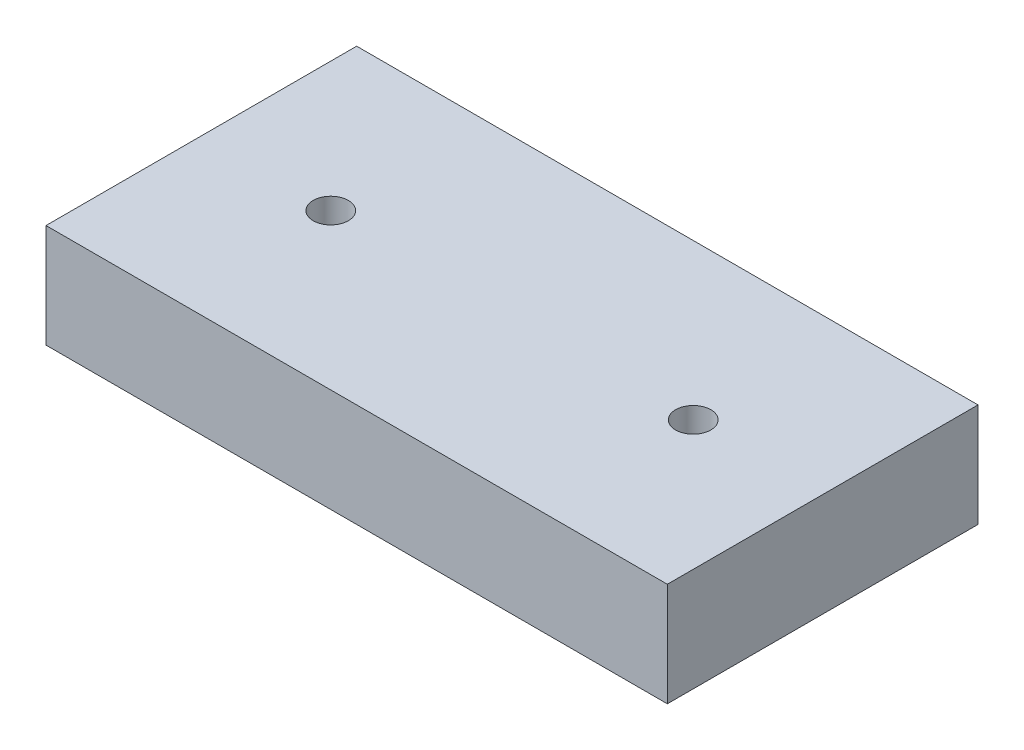
ISO-10303-21;
HEADER;
FILE_DESCRIPTION(('STEP AP214'),'2;1');
FILE_NAME('part.step','',(''),(''),'','','');
FILE_SCHEMA(('AUTOMOTIVE_DESIGN { 1 0 10303 214 1 1 1 1 }'));
ENDSEC;
DATA;
#1=APPLICATION_CONTEXT('core data for automotive mechanical design processes');
#2=APPLICATION_PROTOCOL_DEFINITION('international standard','automotive_design',2000,#1);
#3=PRODUCT_CONTEXT('',#1,'mechanical');
#4=PRODUCT('Part','Part','',(#3));
#5=PRODUCT_RELATED_PRODUCT_CATEGORY('part','',(#4));
#6=PRODUCT_DEFINITION_FORMATION('','',#4);
#7=PRODUCT_DEFINITION_CONTEXT('part definition',#1,'design');
#8=PRODUCT_DEFINITION('design','',#6,#7);
#9=PRODUCT_DEFINITION_SHAPE('','',#8);
#10=(LENGTH_UNIT() NAMED_UNIT(*) SI_UNIT(.MILLI.,.METRE.));
#11=(NAMED_UNIT(*) PLANE_ANGLE_UNIT() SI_UNIT($,.RADIAN.));
#12=(NAMED_UNIT(*) SI_UNIT($,.STERADIAN.) SOLID_ANGLE_UNIT());
#13=UNCERTAINTY_MEASURE_WITH_UNIT(LENGTH_MEASURE(1.E-05),#10,'distance_accuracy_value','');
#14=(GEOMETRIC_REPRESENTATION_CONTEXT(3) GLOBAL_UNCERTAINTY_ASSIGNED_CONTEXT((#13)) GLOBAL_UNIT_ASSIGNED_CONTEXT((#10,
#11,#12)) REPRESENTATION_CONTEXT('',''));
#15=CARTESIAN_POINT('',(0.,0.,0.));
#16=DIRECTION('',(0.,0.,1.));
#17=DIRECTION('',(1.,0.,0.));
#18=AXIS2_PLACEMENT_3D('',#15,#16,#17);
#19=CARTESIAN_POINT('',(0.,0.,0.));
#20=DIRECTION('',(0.,-1.,0.));
#21=DIRECTION('',(0.,0.,-1.));
#22=AXIS2_PLACEMENT_3D('',#19,#20,#21);
#23=PLANE('',#22);
#24=DIRECTION('',(1.,0.,0.));
#25=VECTOR('',#24,1.);
#26=CARTESIAN_POINT('',(-60.,0.,30.));
#27=LINE('',#26,#25);
#28=CARTESIAN_POINT('',(-60.,0.,30.));
#29=VERTEX_POINT('',#28);
#30=CARTESIAN_POINT('',(60.,0.,30.));
#31=VERTEX_POINT('',#30);
#32=EDGE_CURVE('E99',#29,#31,#27,.T.);
#33=ORIENTED_EDGE('',*,*,#32,.F.);
#34=DIRECTION('',(0.,0.,1.));
#35=VECTOR('',#34,1.);
#36=CARTESIAN_POINT('',(-60.,0.,-30.));
#37=LINE('',#36,#35);
#38=CARTESIAN_POINT('',(-60.,0.,-30.));
#39=VERTEX_POINT('',#38);
#40=EDGE_CURVE('E71',#39,#29,#37,.T.);
#41=ORIENTED_EDGE('',*,*,#40,.F.);
#42=DIRECTION('',(1.,0.,0.));
#43=VECTOR('',#42,1.);
#44=CARTESIAN_POINT('',(-60.,0.,-30.));
#45=LINE('',#44,#43);
#46=CARTESIAN_POINT('',(60.,0.,-30.));
#47=VERTEX_POINT('',#46);
#48=EDGE_CURVE('E104',#39,#47,#45,.T.);
#49=ORIENTED_EDGE('',*,*,#48,.T.);
#50=DIRECTION('',(0.,0.,1.));
#51=VECTOR('',#50,1.);
#52=CARTESIAN_POINT('',(60.,0.,-30.));
#53=LINE('',#52,#51);
#54=EDGE_CURVE('E85',#47,#31,#53,.T.);
#55=ORIENTED_EDGE('',*,*,#54,.T.);
#56=EDGE_LOOP('',(#33,#41,#49,#55));
#57=FACE_BOUND('',#56,.T.);
#58=CARTESIAN_POINT('',(35.,0.,0.));
#59=DIRECTION('',(0.,1.,0.));
#60=DIRECTION('',(0.,0.,1.));
#61=AXIS2_PLACEMENT_3D('',#58,#59,#60);
#62=CIRCLE('',#61,3.39999999999999);
#63=CARTESIAN_POINT('',(35.,0.,3.39999999999999));
#64=VERTEX_POINT('',#63);
#65=EDGE_CURVE('E102',#64,#64,#62,.T.);
#66=ORIENTED_EDGE('',*,*,#65,.T.);
#67=EDGE_LOOP('',(#66));
#68=FACE_BOUND('',#67,.T.);
#69=CARTESIAN_POINT('',(-35.,0.,0.));
#70=DIRECTION('',(0.,1.,0.));
#71=DIRECTION('',(0.,0.,1.));
#72=AXIS2_PLACEMENT_3D('',#69,#70,#71);
#73=CIRCLE('',#72,3.39999999999999);
#74=CARTESIAN_POINT('',(-35.,0.,3.39999999999999));
#75=VERTEX_POINT('',#74);
#76=EDGE_CURVE('E119',#75,#75,#73,.T.);
#77=ORIENTED_EDGE('',*,*,#76,.T.);
#78=EDGE_LOOP('',(#77));
#79=FACE_BOUND('',#78,.T.);
#80=ADVANCED_FACE('F36',(#57,#68,#79),#23,.T.);
#81=CARTESIAN_POINT('',(-60.,20.,30.));
#82=DIRECTION('',(0.,0.,-1.));
#83=DIRECTION('',(-1.,0.,0.));
#84=AXIS2_PLACEMENT_3D('',#81,#82,#83);
#85=PLANE('',#84);
#86=ORIENTED_EDGE('',*,*,#32,.T.);
#87=DIRECTION('',(0.,-1.,0.));
#88=VECTOR('',#87,1.);
#89=CARTESIAN_POINT('',(60.,20.,30.));
#90=LINE('',#89,#88);
#91=CARTESIAN_POINT('',(60.,20.,30.));
#92=VERTEX_POINT('',#91);
#93=EDGE_CURVE('E11',#92,#31,#90,.T.);
#94=ORIENTED_EDGE('',*,*,#93,.F.);
#95=DIRECTION('',(1.,0.,0.));
#96=VECTOR('',#95,1.);
#97=CARTESIAN_POINT('',(-60.,20.,30.));
#98=LINE('',#97,#96);
#99=CARTESIAN_POINT('',(-60.,20.,30.));
#100=VERTEX_POINT('',#99);
#101=EDGE_CURVE('E76',#100,#92,#98,.T.);
#102=ORIENTED_EDGE('',*,*,#101,.F.);
#103=DIRECTION('',(0.,-1.,0.));
#104=VECTOR('',#103,1.);
#105=CARTESIAN_POINT('',(-60.,20.,30.));
#106=LINE('',#105,#104);
#107=EDGE_CURVE('E95',#100,#29,#106,.T.);
#108=ORIENTED_EDGE('',*,*,#107,.T.);
#109=EDGE_LOOP('',(#86,#94,#102,#108));
#110=FACE_BOUND('',#109,.T.);
#111=ADVANCED_FACE('F38',(#110),#85,.F.);
#112=CARTESIAN_POINT('',(60.,20.,-30.));
#113=DIRECTION('',(1.,0.,0.));
#114=DIRECTION('',(0.,0.,-1.));
#115=AXIS2_PLACEMENT_3D('',#112,#113,#114);
#116=PLANE('',#115);
#117=ORIENTED_EDGE('',*,*,#54,.F.);
#118=DIRECTION('',(0.,-1.,0.));
#119=VECTOR('',#118,1.);
#120=CARTESIAN_POINT('',(60.,20.,-30.));
#121=LINE('',#120,#119);
#122=CARTESIAN_POINT('',(60.,20.,-30.));
#123=VERTEX_POINT('',#122);
#124=EDGE_CURVE('E45',#123,#47,#121,.T.);
#125=ORIENTED_EDGE('',*,*,#124,.F.);
#126=DIRECTION('',(0.,0.,1.));
#127=VECTOR('',#126,1.);
#128=CARTESIAN_POINT('',(60.,20.,-30.));
#129=LINE('',#128,#127);
#130=EDGE_CURVE('E83',#123,#92,#129,.T.);
#131=ORIENTED_EDGE('',*,*,#130,.T.);
#132=ORIENTED_EDGE('',*,*,#93,.T.);
#133=EDGE_LOOP('',(#117,#125,#131,#132));
#134=FACE_BOUND('',#133,.T.);
#135=ADVANCED_FACE('F82',(#134),#116,.T.);
#136=CARTESIAN_POINT('',(-60.,20.,-30.));
#137=DIRECTION('',(0.,0.,-1.));
#138=DIRECTION('',(-1.,0.,0.));
#139=AXIS2_PLACEMENT_3D('',#136,#137,#138);
#140=PLANE('',#139);
#141=ORIENTED_EDGE('',*,*,#48,.F.);
#142=DIRECTION('',(0.,-1.,0.));
#143=VECTOR('',#142,1.);
#144=CARTESIAN_POINT('',(-60.,20.,-30.));
#145=LINE('',#144,#143);
#146=CARTESIAN_POINT('',(-60.,20.,-30.));
#147=VERTEX_POINT('',#146);
#148=EDGE_CURVE('E68',#147,#39,#145,.T.);
#149=ORIENTED_EDGE('',*,*,#148,.F.);
#150=DIRECTION('',(1.,0.,0.));
#151=VECTOR('',#150,1.);
#152=CARTESIAN_POINT('',(-60.,20.,-30.));
#153=LINE('',#152,#151);
#154=EDGE_CURVE('E91',#147,#123,#153,.T.);
#155=ORIENTED_EDGE('',*,*,#154,.T.);
#156=ORIENTED_EDGE('',*,*,#124,.T.);
#157=EDGE_LOOP('',(#141,#149,#155,#156));
#158=FACE_BOUND('',#157,.T.);
#159=ADVANCED_FACE('F93',(#158),#140,.T.);
#160=CARTESIAN_POINT('',(-60.,20.,-30.));
#161=DIRECTION('',(1.,0.,0.));
#162=DIRECTION('',(0.,0.,-1.));
#163=AXIS2_PLACEMENT_3D('',#160,#161,#162);
#164=PLANE('',#163);
#165=ORIENTED_EDGE('',*,*,#40,.T.);
#166=ORIENTED_EDGE('',*,*,#107,.F.);
#167=DIRECTION('',(0.,0.,1.));
#168=VECTOR('',#167,1.);
#169=CARTESIAN_POINT('',(-60.,20.,-30.));
#170=LINE('',#169,#168);
#171=EDGE_CURVE('E53',#147,#100,#170,.T.);
#172=ORIENTED_EDGE('',*,*,#171,.F.);
#173=ORIENTED_EDGE('',*,*,#148,.T.);
#174=EDGE_LOOP('',(#165,#166,#172,#173));
#175=FACE_BOUND('',#174,.T.);
#176=ADVANCED_FACE('F136',(#175),#164,.F.);
#177=CARTESIAN_POINT('',(0.,20.,0.));
#178=DIRECTION('',(0.,-1.,0.));
#179=DIRECTION('',(0.,0.,-1.));
#180=AXIS2_PLACEMENT_3D('',#177,#178,#179);
#181=PLANE('',#180);
#182=CARTESIAN_POINT('',(-35.,20.,0.));
#183=DIRECTION('',(0.,1.,0.));
#184=DIRECTION('',(0.,0.,1.));
#185=AXIS2_PLACEMENT_3D('',#182,#183,#184);
#186=CIRCLE('',#185,3.39999999999999);
#187=CARTESIAN_POINT('',(-35.,20.,3.39999999999999));
#188=VERTEX_POINT('',#187);
#189=EDGE_CURVE('E122',#188,#188,#186,.T.);
#190=ORIENTED_EDGE('',*,*,#189,.F.);
#191=EDGE_LOOP('',(#190));
#192=FACE_BOUND('',#191,.T.);
#193=CARTESIAN_POINT('',(35.,20.,0.));
#194=DIRECTION('',(0.,1.,0.));
#195=DIRECTION('',(0.,0.,1.));
#196=AXIS2_PLACEMENT_3D('',#193,#194,#195);
#197=CIRCLE('',#196,3.39999999999999);
#198=CARTESIAN_POINT('',(35.,20.,3.39999999999999));
#199=VERTEX_POINT('',#198);
#200=EDGE_CURVE('E121',#199,#199,#197,.T.);
#201=ORIENTED_EDGE('',*,*,#200,.F.);
#202=EDGE_LOOP('',(#201));
#203=FACE_BOUND('',#202,.T.);
#204=ORIENTED_EDGE('',*,*,#101,.T.);
#205=ORIENTED_EDGE('',*,*,#130,.F.);
#206=ORIENTED_EDGE('',*,*,#154,.F.);
#207=ORIENTED_EDGE('',*,*,#171,.T.);
#208=EDGE_LOOP('',(#204,#205,#206,#207));
#209=FACE_BOUND('',#208,.T.);
#210=ADVANCED_FACE('F90',(#192,#203,#209),#181,.F.);
#211=CARTESIAN_POINT('',(35.,20.,0.));
#212=DIRECTION('',(0.,1.,0.));
#213=DIRECTION('',(0.,0.,1.));
#214=AXIS2_PLACEMENT_3D('',#211,#212,#213);
#215=CYLINDRICAL_SURFACE('',#214,3.39999999999999);
#216=ORIENTED_EDGE('',*,*,#65,.F.);
#217=EDGE_LOOP('',(#216));
#218=FACE_BOUND('',#217,.T.);
#219=ORIENTED_EDGE('',*,*,#200,.T.);
#220=EDGE_LOOP('',(#219));
#221=FACE_BOUND('',#220,.T.);
#222=ADVANCED_FACE('F135',(#218,#221),#215,.F.);
#223=CARTESIAN_POINT('',(-35.,20.,0.));
#224=DIRECTION('',(0.,1.,0.));
#225=DIRECTION('',(0.,0.,1.));
#226=AXIS2_PLACEMENT_3D('',#223,#224,#225);
#227=CYLINDRICAL_SURFACE('',#226,3.39999999999999);
#228=ORIENTED_EDGE('',*,*,#76,.F.);
#229=EDGE_LOOP('',(#228));
#230=FACE_BOUND('',#229,.T.);
#231=ORIENTED_EDGE('',*,*,#189,.T.);
#232=EDGE_LOOP('',(#231));
#233=FACE_BOUND('',#232,.T.);
#234=ADVANCED_FACE('F131',(#230,#233),#227,.F.);
#235=CLOSED_SHELL('',(#80,#111,#135,#159,#176,#210,#222,#234));
#236=MANIFOLD_SOLID_BREP('B2',#235);
#237=ADVANCED_BREP_SHAPE_REPRESENTATION('',(#18,#236),#14);
#238=SHAPE_DEFINITION_REPRESENTATION(#9,#237);
ENDSEC;
END-ISO-10303-21;
